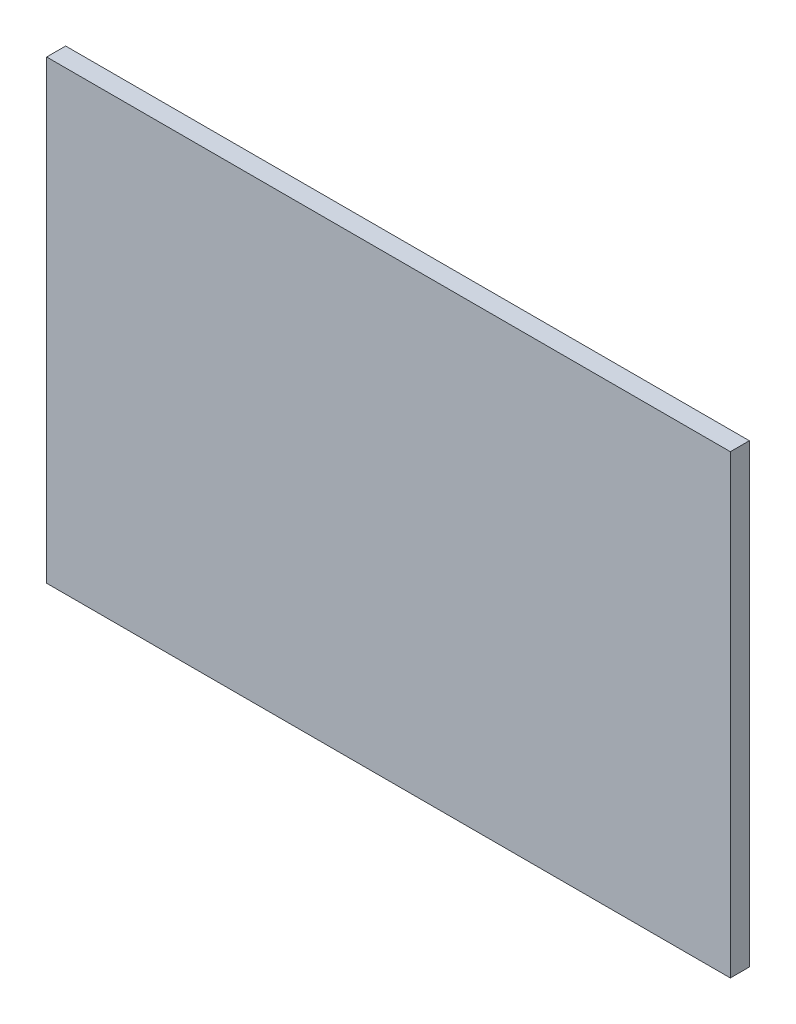
ISO-10303-21;
HEADER;
FILE_DESCRIPTION(('STEP AP214'),'2;1');
FILE_NAME('part.step','',(''),(''),'','','');
FILE_SCHEMA(('AUTOMOTIVE_DESIGN { 1 0 10303 214 1 1 1 1 }'));
ENDSEC;
DATA;
#1=APPLICATION_CONTEXT('core data for automotive mechanical design processes');
#2=APPLICATION_PROTOCOL_DEFINITION('international standard','automotive_design',2000,#1);
#3=PRODUCT_CONTEXT('',#1,'mechanical');
#4=PRODUCT('Part','Part','',(#3));
#5=PRODUCT_RELATED_PRODUCT_CATEGORY('part','',(#4));
#6=PRODUCT_DEFINITION_FORMATION('','',#4);
#7=PRODUCT_DEFINITION_CONTEXT('part definition',#1,'design');
#8=PRODUCT_DEFINITION('design','',#6,#7);
#9=PRODUCT_DEFINITION_SHAPE('','',#8);
#10=(LENGTH_UNIT() NAMED_UNIT(*) SI_UNIT(.MILLI.,.METRE.));
#11=(NAMED_UNIT(*) PLANE_ANGLE_UNIT() SI_UNIT($,.RADIAN.));
#12=(NAMED_UNIT(*) SI_UNIT($,.STERADIAN.) SOLID_ANGLE_UNIT());
#13=UNCERTAINTY_MEASURE_WITH_UNIT(LENGTH_MEASURE(1.E-05),#10,'distance_accuracy_value','');
#14=(GEOMETRIC_REPRESENTATION_CONTEXT(3) GLOBAL_UNCERTAINTY_ASSIGNED_CONTEXT((#13)) GLOBAL_UNIT_ASSIGNED_CONTEXT((#10,
#11,#12)) REPRESENTATION_CONTEXT('',''));
#15=CARTESIAN_POINT('',(0.,0.,0.));
#16=DIRECTION('',(0.,0.,1.));
#17=DIRECTION('',(1.,0.,0.));
#18=AXIS2_PLACEMENT_3D('',#15,#16,#17);
#19=CARTESIAN_POINT('',(0.,0.,20.));
#20=DIRECTION('',(1.,0.,0.));
#21=DIRECTION('',(0.,0.,-1.));
#22=AXIS2_PLACEMENT_3D('',#19,#20,#21);
#23=PLANE('',#22);
#24=DIRECTION('',(0.,-1.,0.));
#25=VECTOR('',#24,1.);
#26=CARTESIAN_POINT('',(0.,0.,0.));
#27=LINE('',#26,#25);
#28=CARTESIAN_POINT('',(0.,480.,0.));
#29=VERTEX_POINT('',#28);
#30=CARTESIAN_POINT('',(0.,0.,0.));
#31=VERTEX_POINT('',#30);
#32=EDGE_CURVE('E102',#29,#31,#27,.T.);
#33=ORIENTED_EDGE('',*,*,#32,.T.);
#34=DIRECTION('',(0.,0.,-1.));
#35=VECTOR('',#34,1.);
#36=CARTESIAN_POINT('',(0.,0.,20.));
#37=LINE('',#36,#35);
#38=CARTESIAN_POINT('',(0.,0.,20.));
#39=VERTEX_POINT('',#38);
#40=EDGE_CURVE('E11',#39,#31,#37,.T.);
#41=ORIENTED_EDGE('',*,*,#40,.F.);
#42=DIRECTION('',(0.,-1.,0.));
#43=VECTOR('',#42,1.);
#44=CARTESIAN_POINT('',(0.,0.,20.));
#45=LINE('',#44,#43);
#46=CARTESIAN_POINT('',(0.,480.,20.));
#47=VERTEX_POINT('',#46);
#48=EDGE_CURVE('E90',#47,#39,#45,.T.);
#49=ORIENTED_EDGE('',*,*,#48,.F.);
#50=DIRECTION('',(0.,0.,-1.));
#51=VECTOR('',#50,1.);
#52=CARTESIAN_POINT('',(0.,480.,20.));
#53=LINE('',#52,#51);
#54=EDGE_CURVE('E98',#47,#29,#53,.T.);
#55=ORIENTED_EDGE('',*,*,#54,.T.);
#56=EDGE_LOOP('',(#33,#41,#49,#55));
#57=FACE_BOUND('',#56,.T.);
#58=ADVANCED_FACE('F39',(#57),#23,.F.);
#59=CARTESIAN_POINT('',(0.,0.,20.));
#60=DIRECTION('',(0.,1.,0.));
#61=DIRECTION('',(0.,0.,1.));
#62=AXIS2_PLACEMENT_3D('',#59,#60,#61);
#63=PLANE('',#62);
#64=DIRECTION('',(1.,0.,0.));
#65=VECTOR('',#64,1.);
#66=CARTESIAN_POINT('',(0.,0.,0.));
#67=LINE('',#66,#65);
#68=CARTESIAN_POINT('',(720.,0.,0.));
#69=VERTEX_POINT('',#68);
#70=EDGE_CURVE('E94',#31,#69,#67,.T.);
#71=ORIENTED_EDGE('',*,*,#70,.T.);
#72=DIRECTION('',(0.,0.,-1.));
#73=VECTOR('',#72,1.);
#74=CARTESIAN_POINT('',(720.,0.,20.));
#75=LINE('',#74,#73);
#76=CARTESIAN_POINT('',(720.,0.,20.));
#77=VERTEX_POINT('',#76);
#78=EDGE_CURVE('E47',#77,#69,#75,.T.);
#79=ORIENTED_EDGE('',*,*,#78,.F.);
#80=DIRECTION('',(1.,0.,0.));
#81=VECTOR('',#80,1.);
#82=CARTESIAN_POINT('',(0.,0.,20.));
#83=LINE('',#82,#81);
#84=EDGE_CURVE('E85',#39,#77,#83,.T.);
#85=ORIENTED_EDGE('',*,*,#84,.F.);
#86=ORIENTED_EDGE('',*,*,#40,.T.);
#87=EDGE_LOOP('',(#71,#79,#85,#86));
#88=FACE_BOUND('',#87,.T.);
#89=ADVANCED_FACE('F93',(#88),#63,.F.);
#90=CARTESIAN_POINT('',(720.,0.,20.));
#91=DIRECTION('',(-1.,0.,0.));
#92=DIRECTION('',(0.,0.,1.));
#93=AXIS2_PLACEMENT_3D('',#90,#91,#92);
#94=PLANE('',#93);
#95=DIRECTION('',(0.,1.,0.));
#96=VECTOR('',#95,1.);
#97=CARTESIAN_POINT('',(720.,0.,0.));
#98=LINE('',#97,#96);
#99=CARTESIAN_POINT('',(720.,480.,0.));
#100=VERTEX_POINT('',#99);
#101=EDGE_CURVE('E72',#69,#100,#98,.T.);
#102=ORIENTED_EDGE('',*,*,#101,.T.);
#103=DIRECTION('',(0.,0.,-1.));
#104=VECTOR('',#103,1.);
#105=CARTESIAN_POINT('',(720.,480.,20.));
#106=LINE('',#105,#104);
#107=CARTESIAN_POINT('',(720.,480.,20.));
#108=VERTEX_POINT('',#107);
#109=EDGE_CURVE('E95',#108,#100,#106,.T.);
#110=ORIENTED_EDGE('',*,*,#109,.F.);
#111=DIRECTION('',(0.,1.,0.));
#112=VECTOR('',#111,1.);
#113=CARTESIAN_POINT('',(720.,0.,20.));
#114=LINE('',#113,#112);
#115=EDGE_CURVE('E88',#77,#108,#114,.T.);
#116=ORIENTED_EDGE('',*,*,#115,.F.);
#117=ORIENTED_EDGE('',*,*,#78,.T.);
#118=EDGE_LOOP('',(#102,#110,#116,#117));
#119=FACE_BOUND('',#118,.T.);
#120=ADVANCED_FACE('F96',(#119),#94,.F.);
#121=CARTESIAN_POINT('',(0.,480.,20.));
#122=DIRECTION('',(0.,-1.,0.));
#123=DIRECTION('',(0.,0.,-1.));
#124=AXIS2_PLACEMENT_3D('',#121,#122,#123);
#125=PLANE('',#124);
#126=DIRECTION('',(-1.,0.,0.));
#127=VECTOR('',#126,1.);
#128=CARTESIAN_POINT('',(0.,480.,0.));
#129=LINE('',#128,#127);
#130=EDGE_CURVE('E78',#100,#29,#129,.T.);
#131=ORIENTED_EDGE('',*,*,#130,.T.);
#132=ORIENTED_EDGE('',*,*,#54,.F.);
#133=DIRECTION('',(-1.,0.,0.));
#134=VECTOR('',#133,1.);
#135=CARTESIAN_POINT('',(0.,480.,20.));
#136=LINE('',#135,#134);
#137=EDGE_CURVE('E55',#108,#47,#136,.T.);
#138=ORIENTED_EDGE('',*,*,#137,.F.);
#139=ORIENTED_EDGE('',*,*,#109,.T.);
#140=EDGE_LOOP('',(#131,#132,#138,#139));
#141=FACE_BOUND('',#140,.T.);
#142=ADVANCED_FACE('F109',(#141),#125,.F.);
#143=CARTESIAN_POINT('',(0.,0.,20.));
#144=DIRECTION('',(0.,0.,-1.));
#145=DIRECTION('',(-1.,0.,0.));
#146=AXIS2_PLACEMENT_3D('',#143,#144,#145);
#147=PLANE('',#146);
#148=ORIENTED_EDGE('',*,*,#48,.T.);
#149=ORIENTED_EDGE('',*,*,#84,.T.);
#150=ORIENTED_EDGE('',*,*,#115,.T.);
#151=ORIENTED_EDGE('',*,*,#137,.T.);
#152=EDGE_LOOP('',(#148,#149,#150,#151));
#153=FACE_BOUND('',#152,.T.);
#154=ADVANCED_FACE('F86',(#153),#147,.F.);
#155=CARTESIAN_POINT('',(0.,0.,0.));
#156=DIRECTION('',(0.,0.,-1.));
#157=DIRECTION('',(-1.,0.,0.));
#158=AXIS2_PLACEMENT_3D('',#155,#156,#157);
#159=PLANE('',#158);
#160=ORIENTED_EDGE('',*,*,#32,.F.);
#161=ORIENTED_EDGE('',*,*,#130,.F.);
#162=ORIENTED_EDGE('',*,*,#101,.F.);
#163=ORIENTED_EDGE('',*,*,#70,.F.);
#164=EDGE_LOOP('',(#160,#161,#162,#163));
#165=FACE_BOUND('',#164,.T.);
#166=ADVANCED_FACE('F112',(#165),#159,.T.);
#167=CLOSED_SHELL('',(#58,#89,#120,#142,#154,#166));
#168=MANIFOLD_SOLID_BREP('B2',#167);
#169=ADVANCED_BREP_SHAPE_REPRESENTATION('',(#18,#168),#14);
#170=SHAPE_DEFINITION_REPRESENTATION(#9,#169);
ENDSEC;
END-ISO-10303-21;
